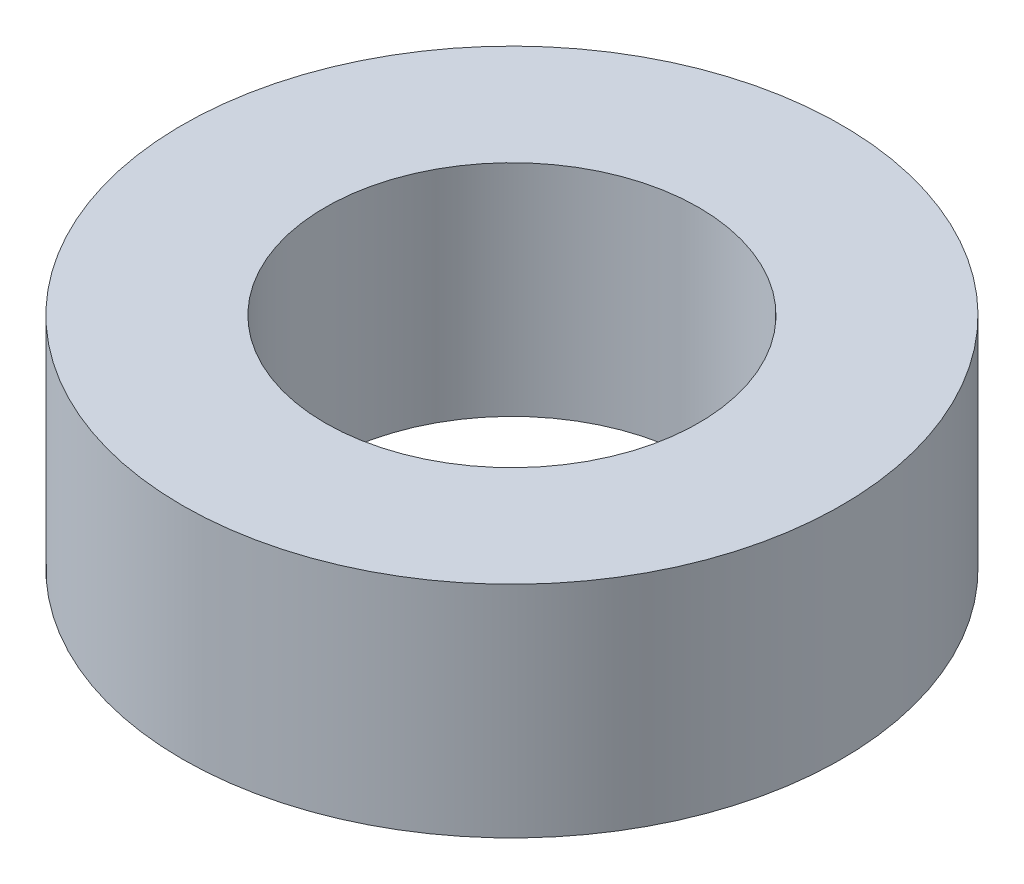
ISO-10303-21;
HEADER;
FILE_DESCRIPTION(('STEP AP214'),'2;1');
FILE_NAME('part.step','',(''),(''),'','','');
FILE_SCHEMA(('AUTOMOTIVE_DESIGN { 1 0 10303 214 1 1 1 1 }'));
ENDSEC;
DATA;
#1=APPLICATION_CONTEXT('core data for automotive mechanical design processes');
#2=APPLICATION_PROTOCOL_DEFINITION('international standard','automotive_design',2000,#1);
#3=PRODUCT_CONTEXT('',#1,'mechanical');
#4=PRODUCT('Part','Part','',(#3));
#5=PRODUCT_RELATED_PRODUCT_CATEGORY('part','',(#4));
#6=PRODUCT_DEFINITION_FORMATION('','',#4);
#7=PRODUCT_DEFINITION_CONTEXT('part definition',#1,'design');
#8=PRODUCT_DEFINITION('design','',#6,#7);
#9=PRODUCT_DEFINITION_SHAPE('','',#8);
#10=(LENGTH_UNIT() NAMED_UNIT(*) SI_UNIT(.MILLI.,.METRE.));
#11=(NAMED_UNIT(*) PLANE_ANGLE_UNIT() SI_UNIT($,.RADIAN.));
#12=(NAMED_UNIT(*) SI_UNIT($,.STERADIAN.) SOLID_ANGLE_UNIT());
#13=UNCERTAINTY_MEASURE_WITH_UNIT(LENGTH_MEASURE(1.E-05),#10,'distance_accuracy_value','');
#14=(GEOMETRIC_REPRESENTATION_CONTEXT(3) GLOBAL_UNCERTAINTY_ASSIGNED_CONTEXT((#13)) GLOBAL_UNIT_ASSIGNED_CONTEXT((#10,
#11,#12)) REPRESENTATION_CONTEXT('',''));
#15=CARTESIAN_POINT('',(0.,0.,0.));
#16=DIRECTION('',(0.,0.,1.));
#17=DIRECTION('',(1.,0.,0.));
#18=AXIS2_PLACEMENT_3D('',#15,#16,#17);
#19=CARTESIAN_POINT('',(0.,2.,0.));
#20=DIRECTION('',(0.,-1.,0.));
#21=DIRECTION('',(0.,0.,-1.));
#22=AXIS2_PLACEMENT_3D('',#19,#20,#21);
#23=CYLINDRICAL_SURFACE('',#22,1.7);
#24=CARTESIAN_POINT('',(0.,2.,0.));
#25=DIRECTION('',(0.,1.,0.));
#26=DIRECTION('',(0.,0.,1.));
#27=AXIS2_PLACEMENT_3D('',#24,#25,#26);
#28=CIRCLE('',#27,1.7);
#29=CARTESIAN_POINT('',(0.,2.,1.7));
#30=VERTEX_POINT('',#29);
#31=EDGE_CURVE('E45',#30,#30,#28,.T.);
#32=ORIENTED_EDGE('',*,*,#31,.T.);
#33=EDGE_LOOP('',(#32));
#34=FACE_BOUND('',#33,.T.);
#35=CARTESIAN_POINT('',(0.,0.,0.));
#36=DIRECTION('',(0.,1.,0.));
#37=DIRECTION('',(0.,0.,1.));
#38=AXIS2_PLACEMENT_3D('',#35,#36,#37);
#39=CIRCLE('',#38,1.7);
#40=CARTESIAN_POINT('',(0.,0.,1.7));
#41=VERTEX_POINT('',#40);
#42=EDGE_CURVE('E11',#41,#41,#39,.T.);
#43=ORIENTED_EDGE('',*,*,#42,.F.);
#44=EDGE_LOOP('',(#43));
#45=FACE_BOUND('',#44,.T.);
#46=ADVANCED_FACE('F16',(#34,#45),#23,.F.);
#47=CARTESIAN_POINT('',(0.,2.,0.));
#48=DIRECTION('',(0.,-1.,0.));
#49=DIRECTION('',(0.,0.,-1.));
#50=AXIS2_PLACEMENT_3D('',#47,#48,#49);
#51=CYLINDRICAL_SURFACE('',#50,3.);
#52=CARTESIAN_POINT('',(0.,2.,0.));
#53=DIRECTION('',(0.,1.,0.));
#54=DIRECTION('',(0.,0.,1.));
#55=AXIS2_PLACEMENT_3D('',#52,#53,#54);
#56=CIRCLE('',#55,3.);
#57=CARTESIAN_POINT('',(0.,2.,3.));
#58=VERTEX_POINT('',#57);
#59=EDGE_CURVE('E52',#58,#58,#56,.T.);
#60=ORIENTED_EDGE('',*,*,#59,.F.);
#61=EDGE_LOOP('',(#60));
#62=FACE_BOUND('',#61,.T.);
#63=CARTESIAN_POINT('',(0.,0.,0.));
#64=DIRECTION('',(0.,1.,0.));
#65=DIRECTION('',(0.,0.,1.));
#66=AXIS2_PLACEMENT_3D('',#63,#64,#65);
#67=CIRCLE('',#66,3.);
#68=CARTESIAN_POINT('',(0.,0.,3.));
#69=VERTEX_POINT('',#68);
#70=EDGE_CURVE('E25',#69,#69,#67,.T.);
#71=ORIENTED_EDGE('',*,*,#70,.T.);
#72=EDGE_LOOP('',(#71));
#73=FACE_BOUND('',#72,.T.);
#74=ADVANCED_FACE('F67',(#62,#73),#51,.T.);
#75=CARTESIAN_POINT('',(0.,0.,0.));
#76=DIRECTION('',(0.,1.,0.));
#77=DIRECTION('',(1.,0.,0.));
#78=AXIS2_PLACEMENT_3D('',#75,#76,#77);
#79=PLANE('',#78);
#80=ORIENTED_EDGE('',*,*,#42,.T.);
#81=EDGE_LOOP('',(#80));
#82=FACE_BOUND('',#81,.T.);
#83=ORIENTED_EDGE('',*,*,#70,.F.);
#84=EDGE_LOOP('',(#83));
#85=FACE_BOUND('',#84,.T.);
#86=ADVANCED_FACE('F69',(#82,#85),#79,.F.);
#87=CARTESIAN_POINT('',(0.,2.,0.));
#88=DIRECTION('',(0.,1.,0.));
#89=DIRECTION('',(1.,0.,0.));
#90=AXIS2_PLACEMENT_3D('',#87,#88,#89);
#91=PLANE('',#90);
#92=ORIENTED_EDGE('',*,*,#31,.F.);
#93=EDGE_LOOP('',(#92));
#94=FACE_BOUND('',#93,.T.);
#95=ORIENTED_EDGE('',*,*,#59,.T.);
#96=EDGE_LOOP('',(#95));
#97=FACE_BOUND('',#96,.T.);
#98=ADVANCED_FACE('F53',(#94,#97),#91,.T.);
#99=CLOSED_SHELL('',(#46,#74,#86,#98));
#100=MANIFOLD_SOLID_BREP('B1',#99);
#101=ADVANCED_BREP_SHAPE_REPRESENTATION('',(#18,#100),#14);
#102=SHAPE_DEFINITION_REPRESENTATION(#9,#101);
ENDSEC;
END-ISO-10303-21;
